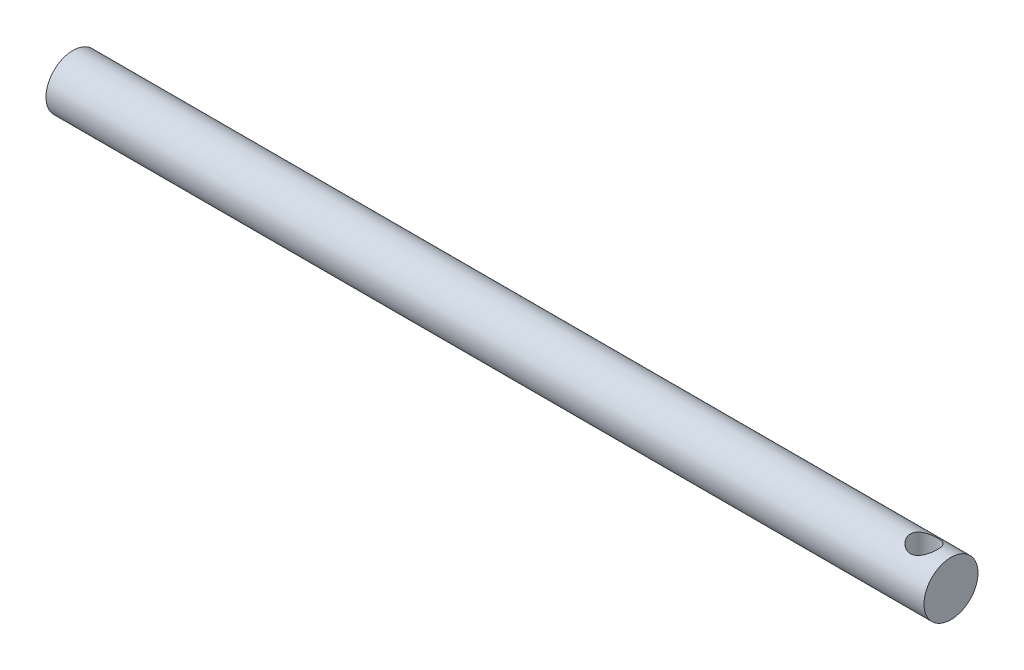
ISO-10303-21;
HEADER;
FILE_DESCRIPTION(('STEP AP214'),'2;1');
FILE_NAME('part.step','',(''),(''),'','','');
FILE_SCHEMA(('AUTOMOTIVE_DESIGN { 1 0 10303 214 1 1 1 1 }'));
ENDSEC;
DATA;
#1=APPLICATION_CONTEXT('core data for automotive mechanical design processes');
#2=APPLICATION_PROTOCOL_DEFINITION('international standard','automotive_design',2000,#1);
#3=PRODUCT_CONTEXT('',#1,'mechanical');
#4=PRODUCT('Part','Part','',(#3));
#5=PRODUCT_RELATED_PRODUCT_CATEGORY('part','',(#4));
#6=PRODUCT_DEFINITION_FORMATION('','',#4);
#7=PRODUCT_DEFINITION_CONTEXT('part definition',#1,'design');
#8=PRODUCT_DEFINITION('design','',#6,#7);
#9=PRODUCT_DEFINITION_SHAPE('','',#8);
#10=(LENGTH_UNIT() NAMED_UNIT(*) SI_UNIT(.MILLI.,.METRE.));
#11=(NAMED_UNIT(*) PLANE_ANGLE_UNIT() SI_UNIT($,.RADIAN.));
#12=(NAMED_UNIT(*) SI_UNIT($,.STERADIAN.) SOLID_ANGLE_UNIT());
#13=UNCERTAINTY_MEASURE_WITH_UNIT(LENGTH_MEASURE(1.E-05),#10,'distance_accuracy_value','');
#14=(GEOMETRIC_REPRESENTATION_CONTEXT(3) GLOBAL_UNCERTAINTY_ASSIGNED_CONTEXT((#13)) GLOBAL_UNIT_ASSIGNED_CONTEXT((#10,
#11,#12)) REPRESENTATION_CONTEXT('',''));
#15=CARTESIAN_POINT('',(0.,0.,0.));
#16=DIRECTION('',(0.,0.,1.));
#17=DIRECTION('',(1.,0.,0.));
#18=AXIS2_PLACEMENT_3D('',#15,#16,#17);
#19=CARTESIAN_POINT('',(325.,0.,0.));
#20=DIRECTION('',(-1.,0.,0.));
#21=DIRECTION('',(0.,0.,1.));
#22=AXIS2_PLACEMENT_3D('',#19,#20,#21);
#23=CYLINDRICAL_SURFACE('',#22,10.);
#24=CARTESIAN_POINT('',(310.,-10.,0.));
#25=CARTESIAN_POINT('',(310.000000432216,-9.99999960171885,0.131488890078728));
#26=CARTESIAN_POINT('',(310.005192775285,-9.99740053121284,0.262986970217151));
#27=CARTESIAN_POINT('',(310.025902894112,-9.98706977835168,0.525014586348055));
#28=CARTESIAN_POINT('',(310.041425161764,-9.97933586314931,0.655543676003293));
#29=CARTESIAN_POINT('',(310.082640779477,-9.95892066969002,0.914783203431131));
#30=CARTESIAN_POINT('',(310.108348634406,-9.94623233642882,1.04349077535257));
#31=CARTESIAN_POINT('',(310.169650672563,-9.91622716576671,1.29802636754293));
#32=CARTESIAN_POINT('',(310.205248897406,-9.89890843630383,1.42385318781692));
#33=CARTESIAN_POINT('',(310.285778482451,-9.86015430154804,1.67121386584967));
#34=CARTESIAN_POINT('',(310.330668648548,-9.83873709670758,1.79276399094562));
#35=CARTESIAN_POINT('',(310.429448797807,-9.79224427489324,2.0314444775119));
#36=CARTESIAN_POINT('',(310.483342168193,-9.7671672814684,2.14857315511666));
#37=CARTESIAN_POINT('',(310.657799628939,-9.68730860488736,2.49222561412915));
#38=CARTESIAN_POINT('',(310.79123077324,-9.6278546021617,2.71128846115304));
#39=CARTESIAN_POINT('',(311.097605281245,-9.49780663424162,3.13758045755123));
#40=CARTESIAN_POINT('',(311.27245069028,-9.42675632671348,3.34329192972866));
#41=CARTESIAN_POINT('',(311.652589088283,-9.28300214475254,3.72388133818107));
#42=CARTESIAN_POINT('',(311.857905061984,-9.21029705743543,3.89873577832561));
#43=CARTESIAN_POINT('',(312.312475147464,-9.06493867332993,4.22628385620053));
#44=CARTESIAN_POINT('',(312.563901891317,-8.99272664170302,4.37620734766692));
#45=CARTESIAN_POINT('',(312.959918044368,-8.89637417546677,4.56723365243867));
#46=CARTESIAN_POINT('',(313.09511829056,-8.86624279684719,4.62527981130996));
#47=CARTESIAN_POINT('',(313.371001251774,-8.81109611627222,4.72948843578256));
#48=CARTESIAN_POINT('',(313.511680663639,-8.78607778701963,4.77565793744268));
#49=CARTESIAN_POINT('',(313.788992754156,-8.74350562362059,4.85313805846159));
#50=CARTESIAN_POINT('',(313.925370479978,-8.72559704108876,4.88516762296957));
#51=CARTESIAN_POINT('',(314.20092569748,-8.69596333711106,4.93772573892404));
#52=CARTESIAN_POINT('',(314.340101663006,-8.68423493515241,4.95826039236647));
#53=CARTESIAN_POINT('',(314.620007461111,-8.66746161087015,4.98752398958935));
#54=CARTESIAN_POINT('',(314.760736306314,-8.66241266349288,4.99626004329764));
#55=CARTESIAN_POINT('',(315.04250117629,-8.65921299638945,5.00180399494054));
#56=CARTESIAN_POINT('',(315.183537170471,-8.6610616185123,4.99861303092503));
#57=CARTESIAN_POINT('',(315.447703572877,-8.67093727173594,4.98145803092845));
#58=CARTESIAN_POINT('',(315.57095260281,-8.67819663501131,4.9688320837109));
#59=CARTESIAN_POINT('',(315.815821213967,-8.69773906996624,4.93454402662213));
#60=CARTESIAN_POINT('',(315.937440271022,-8.71002371946269,4.91287907868332));
#61=CARTESIAN_POINT('',(316.178197874313,-8.7392147957695,4.86076278292652));
#62=CARTESIAN_POINT('',(316.29733672485,-8.75612065195561,4.83031251988903));
#63=CARTESIAN_POINT('',(316.532471376954,-8.79403073984606,4.76094319159973));
#64=CARTESIAN_POINT('',(316.648465923276,-8.81503658165343,4.72202079856856));
#65=CARTESIAN_POINT('',(316.996006871619,-8.88436032421637,4.59108661358501));
#66=CARTESIAN_POINT('',(317.221693356038,-8.93828791833521,4.48608785825885));
#67=CARTESIAN_POINT('',(317.653210118223,-9.05517433078603,4.24519591002762));
#68=CARTESIAN_POINT('',(317.859031417759,-9.11813720101033,4.10928884013352));
#69=CARTESIAN_POINT('',(318.272588528204,-9.25565455759081,3.79034422310326));
#70=CARTESIAN_POINT('',(318.477258007707,-9.33066654203131,3.60351571642875));
#71=CARTESIAN_POINT('',(318.853703465689,-9.47739013910051,3.19773444843251));
#72=CARTESIAN_POINT('',(319.025463723821,-9.54910016205802,2.97876642220595));
#73=CARTESIAN_POINT('',(319.258440897113,-9.65034506582222,2.62430600098779));
#74=CARTESIAN_POINT('',(319.333352095146,-9.68370380274256,2.49871002336157));
#75=CARTESIAN_POINT('',(319.472208202972,-9.74663052718474,2.24071060142557));
#76=CARTESIAN_POINT('',(319.536157735591,-9.77620011135784,2.10831005755406));
#77=CARTESIAN_POINT('',(319.652398875383,-9.83067553510546,1.83762803314801));
#78=CARTESIAN_POINT('',(319.704695175525,-9.85558325144947,1.69934894682176));
#79=CARTESIAN_POINT('',(319.79702492908,-9.89999026457504,1.41791187896082));
#80=CARTESIAN_POINT('',(319.837059793182,-9.91949018350379,1.27475446078986));
#81=CARTESIAN_POINT('',(319.901533563503,-9.95109597328192,0.996798015430399));
#82=CARTESIAN_POINT('',(319.926989515402,-9.96368046334326,0.862288674029779));
#83=CARTESIAN_POINT('',(319.966808041224,-9.98343035732268,0.59124836001245));
#84=CARTESIAN_POINT('',(319.98117159579,-9.99059624028198,0.454717567193943));
#85=CARTESIAN_POINT('',(319.998613162034,-9.99930380487356,0.180810709359644));
#86=CARTESIAN_POINT('',(320.001695494267,-10.000847639673,0.043434988135895));
#87=CARTESIAN_POINT('',(319.996544426081,-9.99827237859039,-0.231047608581555));
#88=CARTESIAN_POINT('',(319.988311526451,-9.99415353332644,-0.368154495704342));
#89=CARTESIAN_POINT('',(319.961721326159,-9.98090973082445,-0.630324023952248));
#90=CARTESIAN_POINT('',(319.944201622407,-9.97219922243105,-0.755493751243224));
#91=CARTESIAN_POINT('',(319.899825526429,-9.95027227352716,-1.00380426086805));
#92=CARTESIAN_POINT('',(319.872966176907,-9.93705440583578,-1.12694438760008));
#93=CARTESIAN_POINT('',(319.810197316637,-9.90642450404114,-1.37032307172127));
#94=CARTESIAN_POINT('',(319.774290575322,-9.88901375346267,-1.49056250470178));
#95=CARTESIAN_POINT('',(319.693771838677,-9.85039368148873,-1.7274794686754));
#96=CARTESIAN_POINT('',(319.649156508647,-9.82918290524069,-1.84415561535683));
#97=CARTESIAN_POINT('',(319.50005219315,-9.75922876416582,-2.19430354472274));
#98=CARTESIAN_POINT('',(319.382059258215,-9.70504904478179,-2.42111320848943));
#99=CARTESIAN_POINT('',(319.11444780678,-9.58719375745592,-2.85234560158079));
#100=CARTESIAN_POINT('',(318.964815818008,-9.5235141477638,-3.05675873773467));
#101=CARTESIAN_POINT('',(318.621212708963,-9.38541505392104,-3.45882132675024));
#102=CARTESIAN_POINT('',(318.424330408248,-9.31055499361996,-3.65383533419943));
#103=CARTESIAN_POINT('',(318.000329462866,-9.16310881759144,-4.00930667677965));
#104=CARTESIAN_POINT('',(317.773190076002,-9.09052430437332,-4.16974010650664));
#105=CARTESIAN_POINT('',(317.407509433771,-8.98785260582618,-4.3846601691921));
#106=CARTESIAN_POINT('',(317.278149125457,-8.95395955241384,-4.45326762267119));
#107=CARTESIAN_POINT('',(317.013105899221,-8.89022352415079,-4.57918112262682));
#108=CARTESIAN_POINT('',(316.877425879624,-8.8603787168037,-4.63649228788886));
#109=CARTESIAN_POINT('',(316.600722964675,-8.80590327365628,-4.73913999074898));
#110=CARTESIAN_POINT('',(316.45970454425,-8.78126837994729,-4.78448631442401));
#111=CARTESIAN_POINT('',(316.173308957175,-8.73822819098158,-4.86265004333096));
#112=CARTESIAN_POINT('',(316.027932469172,-8.71982193121851,-4.8954693884711));
#113=CARTESIAN_POINT('',(315.748235018465,-8.69151275671387,-4.94553834792941));
#114=CARTESIAN_POINT('',(315.61419211688,-8.68096327035261,-4.96397997433444));
#115=CARTESIAN_POINT('',(315.344714754303,-8.66606824539578,-4.98993873206132));
#116=CARTESIAN_POINT('',(315.209280440605,-8.66172205679784,-4.99745700797002));
#117=CARTESIAN_POINT('',(314.938243074995,-8.65941425656731,-5.00145477351747));
#118=CARTESIAN_POINT('',(314.80264009915,-8.66145040076354,-4.99793814327598));
#119=CARTESIAN_POINT('',(314.532414442052,-8.67181681785817,-4.97992974203945));
#120=CARTESIAN_POINT('',(314.397791720895,-8.68014683308829,-4.96543842034335));
#121=CARTESIAN_POINT('',(314.143439797841,-8.70167828744801,-4.92759757627215));
#122=CARTESIAN_POINT('',(314.023517440376,-8.71433770908853,-4.90522766015));
#123=CARTESIAN_POINT('',(313.786138809433,-8.74411599480516,-4.85194376743194));
#124=CARTESIAN_POINT('',(313.668683310666,-8.76123623781642,-4.82102714868722));
#125=CARTESIAN_POINT('',(313.321082884887,-8.81854231868725,-4.71590306073959));
#126=CARTESIAN_POINT('',(313.095543905014,-8.86468813771129,-4.62929708984156));
#127=CARTESIAN_POINT('',(312.646839657688,-8.97142890954605,-4.41907164675022));
#128=CARTESIAN_POINT('',(312.424851924011,-9.03278633647388,-4.29335633682033));
#129=CARTESIAN_POINT('',(312.003635890404,-9.16176636495219,-4.01075421010745));
#130=CARTESIAN_POINT('',(311.804419516556,-9.22939221620456,-3.85385117607731));
#131=CARTESIAN_POINT('',(311.409292141529,-9.3731144460079,-3.49102748964404));
#132=CARTESIAN_POINT('',(311.216723981232,-9.44924162905912,-3.28146736342597));
#133=CARTESIAN_POINT('',(310.868665578817,-9.59389514971536,-2.83072875767412));
#134=CARTESIAN_POINT('',(310.713195322256,-9.66241737976038,-2.58953334336122));
#135=CARTESIAN_POINT('',(310.511369585473,-9.75419013375831,-2.20753881885371));
#136=CARTESIAN_POINT('',(310.449132920594,-9.78304209980294,-2.07625512570268));
#137=CARTESIAN_POINT('',(310.33606384388,-9.83614745234556,-1.80799529933997));
#138=CARTESIAN_POINT('',(310.285225829469,-9.8604030970797,-1.6710220020515));
#139=CARTESIAN_POINT('',(310.195654561633,-9.90354484128718,-1.39269501068687));
#140=CARTESIAN_POINT('',(310.156894907012,-9.92244264379385,-1.25135162347081));
#141=CARTESIAN_POINT('',(310.091862403731,-9.95434618112011,-0.965237205795553));
#142=CARTESIAN_POINT('',(310.065581927473,-9.96735551489675,-0.820468326048366));
#143=CARTESIAN_POINT('',(310.030525468001,-9.98476387878718,-0.563041654408151));
#144=CARTESIAN_POINT('',(310.019088246308,-9.99046741601666,-0.450825809730017));
#145=CARTESIAN_POINT('',(310.00382522175,-9.99808569986015,-0.22574224605026));
#146=CARTESIAN_POINT('',(309.999999628971,-10.000000341898,-0.112874509142186));
#147=CARTESIAN_POINT('',(310.,-10.,0.));
#148=B_SPLINE_CURVE_WITH_KNOTS('',3,(#24,#25,#26,#27,#28,#29,#30,#31,#32,#33,#34,#35,#36,#37,
#38,#39,#40,#41,#42,#43,#44,#45,#46,#47,#48,#49,#50,#51,#52,#53,#54,#55,#56,#57,#58,#59,#60,#61,
#62,#63,#64,#65,#66,#67,#68,#69,#70,#71,#72,#73,#74,#75,#76,#77,#78,#79,#80,#81,#82,#83,#84,#85,
#86,#87,#88,#89,#90,#91,#92,#93,#94,#95,#96,#97,#98,#99,#100,#101,#102,#103,#104,#105,#106,#107,
#108,#109,#110,#111,#112,#113,#114,#115,#116,#117,#118,#119,#120,#121,#122,#123,#124,#125,#126,
#127,#128,#129,#130,#131,#132,#133,#134,#135,#136,#137,#138,#139,#140,#141,#142,#143,#144,#145,
#146,#147),.UNSPECIFIED.,.T.,.F.,(4,2,2,2,2,2,2,2,2,2,2,2,2,2,2,2,2,2,2,2,2,2,2,2,2,2,2,2,2,2,2,
2,2,2,2,2,2,2,2,2,2,2,2,2,2,2,2,2,2,2,2,2,2,2,2,2,2,2,2,2,2,4),(0.,0.394355294649889,
0.788882184037817,1.18397293369034,1.57922537181693,1.97276168530544,2.36644639154631,
3.15295441699267,3.98704440767526,4.82176680235499,5.72122193562247,6.17125359989456,
6.62101803579303,7.04410338623952,7.46696393118359,7.88956954321094,8.3121348321667,
8.68401534897466,9.05601271689176,9.42796417149682,9.80006198990957,10.56083380205,
11.3219478566367,12.1795688603196,13.03759852356,13.4870830845772,13.9363776171859,
14.3854908824168,14.8345524573652,15.2464230691106,15.6582572644723,16.0699337163998,
16.4815919489941,16.861220064051,17.240968493866,17.6206008225791,18.0003788066131,
18.7808755264614,19.5617052624834,20.4192132572738,21.2773121558254,21.7277011924365,
22.1778856687595,22.6277007885002,23.0774462222893,23.4840267197958,23.8905646113035,
24.2969595710183,24.7033378940059,25.0708552370354,25.4384863225851,26.1732662495598,
26.9574126491566,27.7419678673238,28.6218519479817,29.5022089791541,29.9460734671027,
30.3897193096443,30.8323885049026,31.2747867798492,31.6133053554876,31.9518332743451),.UNSPECIFIED.);
#149=CARTESIAN_POINT('',(310.,-10.,0.));
#150=VERTEX_POINT('',#149);
#151=EDGE_CURVE('E10',#150,#150,#148,.T.);
#152=ORIENTED_EDGE('',*,*,#151,.T.);
#153=EDGE_LOOP('',(#152));
#154=FACE_BOUND('',#153,.T.);
#155=CARTESIAN_POINT('',(315.,8.66025403784439,4.99999999999999));
#156=CARTESIAN_POINT('',(314.869668343204,8.66025482828519,4.99999937774202));
#157=CARTESIAN_POINT('',(314.739325091653,8.66320639320551,4.99489703999514));
#158=CARTESIAN_POINT('',(314.479644781747,8.67490215579888,4.97455590140418));
#159=CARTESIAN_POINT('',(314.3503082202,8.68364905023327,4.9593123815141));
#160=CARTESIAN_POINT('',(314.093486462436,8.70662912382781,4.91885673177676));
#161=CARTESIAN_POINT('',(313.966004496215,8.72087090589727,4.89362896878987));
#162=CARTESIAN_POINT('',(313.713982535512,8.75432466229382,4.83352579766962));
#163=CARTESIAN_POINT('',(313.589443845965,8.77353879767271,4.79864619425835));
#164=CARTESIAN_POINT('',(313.222888792466,8.83745677232209,4.68053466147078));
#165=CARTESIAN_POINT('',(312.986267679266,8.8885988097752,4.58356144574884));
#166=CARTESIAN_POINT('',(312.532838045211,9.00213659941723,4.35632594214355));
#167=CARTESIAN_POINT('',(312.316030597053,9.06453296036385,4.22606185336435));
#168=CARTESIAN_POINT('',(311.888489382253,9.19984032823,3.92334549410418));
#169=CARTESIAN_POINT('',(311.679731417677,9.27319410334728,3.74829976483492));
#170=CARTESIAN_POINT('',(311.292930948451,9.41860822234892,3.36622943427773));
#171=CARTESIAN_POINT('',(311.114903765034,9.49066790509843,3.15918897852743));
#172=CARTESIAN_POINT('',(310.868773571314,9.59484443095073,2.82033206345805));
#173=CARTESIAN_POINT('',(310.788086847899,9.62993554487431,2.69838192133583));
#174=CARTESIAN_POINT('',(310.637371334578,9.69680156689126,2.4472213123705));
#175=CARTESIAN_POINT('',(310.567338302637,9.72857779329812,2.31801376345372));
#176=CARTESIAN_POINT('',(310.438623768707,9.78789520431625,2.05317391777881));
#177=CARTESIAN_POINT('',(310.37993934252,9.81543747951443,1.91754328730046));
#178=CARTESIAN_POINT('',(310.274568984172,9.86547242365067,1.64079696990286));
#179=CARTESIAN_POINT('',(310.227881777567,9.88796562891049,1.49968186742445));
#180=CARTESIAN_POINT('',(310.149984487482,9.92580359946711,1.2233043659956));
#181=CARTESIAN_POINT('',(310.117909890397,9.94154295735176,1.08833937324156));
#182=CARTESIAN_POINT('',(310.065033571396,9.96761571585522,0.815709188800214));
#183=CARTESIAN_POINT('',(310.04423075194,9.97794964280152,0.678044261360656));
#184=CARTESIAN_POINT('',(310.014180088583,9.99290900237256,0.401217055741356));
#185=CARTESIAN_POINT('',(310.004926667024,9.99753719051025,0.262055533104011));
#186=CARTESIAN_POINT('',(309.998085666602,10.0009568128334,-0.0166220416280668));
#187=CARTESIAN_POINT('',(310.000497374007,9.99974860411976,-0.156138071510179));
#188=CARTESIAN_POINT('',(310.016230602951,9.99189263105534,-0.42215828714551));
#189=CARTESIAN_POINT('',(310.028581770782,9.9857287219252,-0.548735568605429));
#190=CARTESIAN_POINT('',(310.062832572355,9.9687211507105,-0.800312348574858));
#191=CARTESIAN_POINT('',(310.084735221026,9.95787601100424,-0.925311336065673));
#192=CARTESIAN_POINT('',(310.137846224237,9.93176736436012,-1.17280363036127));
#193=CARTESIAN_POINT('',(310.169051465862,9.91650533549045,-1.29529776073401));
#194=CARTESIAN_POINT('',(310.240447651518,9.88192155120269,-1.53706747687732));
#195=CARTESIAN_POINT('',(310.280642037248,9.86259824100145,-1.65634181022019));
#196=CARTESIAN_POINT('',(310.415374539564,9.79859222392452,-2.01140340124726));
#197=CARTESIAN_POINT('',(310.523368958893,9.74822622058319,-2.24122720645221));
#198=CARTESIAN_POINT('',(310.771329692493,9.63687815372568,-2.67992393299633));
#199=CARTESIAN_POINT('',(310.911307453156,9.57589229137332,-2.88878931500036));
#200=CARTESIAN_POINT('',(311.234463473773,9.44222356886893,-3.30085071454947));
#201=CARTESIAN_POINT('',(311.420474603121,9.36897995679248,-3.5016445201989));
#202=CARTESIAN_POINT('',(311.822989193921,9.22270586177089,-3.87054772569915));
#203=CARTESIAN_POINT('',(312.039515896908,9.14967558498934,-4.03863197852245));
#204=CARTESIAN_POINT('',(312.391193537281,9.04390911775426,-4.26795395788388));
#205=CARTESIAN_POINT('',(312.51705093115,9.00829977481544,-4.34240098162069));
#206=CARTESIAN_POINT('',(312.77551387827,8.94051483957136,-4.48030007564992));
#207=CARTESIAN_POINT('',(312.908116558879,8.90833780332001,-4.54375677655285));
#208=CARTESIAN_POINT('',(313.179203490355,8.84860631442919,-4.65901104656174));
#209=CARTESIAN_POINT('',(313.317684118981,8.82104906525584,-4.71081567564996));
#210=CARTESIAN_POINT('',(313.599621346051,8.77164844236192,-4.80217514780261));
#211=CARTESIAN_POINT('',(313.743077263025,8.74980428958557,-4.841731661194));
#212=CARTESIAN_POINT('',(314.022256935075,8.71426171459814,-4.90539138118895));
#213=CARTESIAN_POINT('',(314.157693733557,8.70005532848252,-4.93047005719822));
#214=CARTESIAN_POINT('',(314.430671907805,8.67788216659554,-4.9693929943291));
#215=CARTESIAN_POINT('',(314.568213023391,8.66991462570622,-4.9832386330527));
#216=CARTESIAN_POINT('',(314.844115492459,8.66056020235634,-4.99947854378904));
#217=CARTESIAN_POINT('',(314.98247633223,8.65916956150025,-5.00187935599939));
#218=CARTESIAN_POINT('',(315.258820904932,8.66301922537735,-4.99520900229024));
#219=CARTESIAN_POINT('',(315.396804662689,8.6682590825254,-4.98613861072293));
#220=CARTESIAN_POINT('',(315.656088079399,8.68421505193303,-4.95828928039378));
#221=CARTESIAN_POINT('',(315.777556714335,8.69426699139329,-4.94068517767343));
#222=CARTESIAN_POINT('',(316.018417575916,8.71910498639123,-4.8967167334579));
#223=CARTESIAN_POINT('',(316.137809151073,8.73389250003321,-4.87034969372092));
#224=CARTESIAN_POINT('',(316.491710041443,8.78469607426189,-4.77850297980869));
#225=CARTESIAN_POINT('',(316.722114291832,8.82716454630259,-4.7002591459757));
#226=CARTESIAN_POINT('',(317.177093235683,8.92681241600885,-4.50823244687956));
#227=CARTESIAN_POINT('',(317.400903691952,8.98458205429472,-4.39297142446301));
#228=CARTESIAN_POINT('',(317.82733774558,9.10780608277643,-4.1314342135104));
#229=CARTESIAN_POINT('',(318.029950379078,9.1732644129012,-3.9851420924436));
#230=CARTESIAN_POINT('',(318.434891403638,9.3143979576891,-3.64419701683801));
#231=CARTESIAN_POINT('',(318.63396448388,9.3903209386106,-3.44577250062106));
#232=CARTESIAN_POINT('',(318.997082466847,9.53671997076951,-3.01697632238967));
#233=CARTESIAN_POINT('',(319.161115537395,9.60719417697592,-2.78659391213233));
#234=CARTESIAN_POINT('',(319.379009473771,9.70419418614479,-2.41774074756938));
#235=CARTESIAN_POINT('',(319.44766209982,9.73542921288423,-2.28903769990886));
#236=CARTESIAN_POINT('',(319.573756518654,9.79367711332059,-2.02535752273873));
#237=CARTESIAN_POINT('',(319.631203276876,9.82069185600805,-1.89038320507349));
#238=CARTESIAN_POINT('',(319.734217908457,9.86968940022035,-1.61516754079526));
#239=CARTESIAN_POINT('',(319.779791447889,9.89167460130352,-1.47492874316052));
#240=CARTESIAN_POINT('',(319.858509076018,9.92995088678441,-1.19024723850078));
#241=CARTESIAN_POINT('',(319.891654638615,9.94624264638291,-1.04580503217189));
#242=CARTESIAN_POINT('',(319.942595033624,9.97139931839171,-0.76740144168214));
#243=CARTESIAN_POINT('',(319.961519602643,9.98080865626407,-0.633694933854994));
#244=CARTESIAN_POINT('',(319.988493453182,9.99424478074505,-0.364924207537142));
#245=CARTESIAN_POINT('',(319.996543574957,9.9982719832244,-0.229860094759451));
#246=CARTESIAN_POINT('',(320.001663177181,10.0008314531461,0.0404881253987078));
#247=CARTESIAN_POINT('',(319.998735853363,9.999365319798,0.17577215729487));
#248=CARTESIAN_POINT('',(319.981947452247,9.99098333266103,0.4454852394891));
#249=CARTESIAN_POINT('',(319.968086675948,9.98406762889855,0.579914313221414));
#250=CARTESIAN_POINT('',(319.930882320583,9.96560870935097,0.838004211928003));
#251=CARTESIAN_POINT('',(319.908227165773,9.95440210269675,0.961788818118142));
#252=CARTESIAN_POINT('',(319.853786844462,9.92767317989822,1.2068703249142));
#253=CARTESIAN_POINT('',(319.821998770643,9.91214948953036,1.32816642014823));
#254=CARTESIAN_POINT('',(319.713391755729,9.859612953764,1.68709586409474));
#255=CARTESIAN_POINT('',(319.623298074914,9.8166181760533,1.91998814282435));
#256=CARTESIAN_POINT('',(319.40635777828,9.71629432734439,2.37715486497024));
#257=CARTESIAN_POINT('',(319.278104034551,9.65843082383811,2.60063468941493));
#258=CARTESIAN_POINT('',(318.990209694815,9.53440669320975,3.02386422902505));
#259=CARTESIAN_POINT('',(318.830554682968,9.46824226032903,3.22360297720277));
#260=CARTESIAN_POINT('',(318.466024828893,9.32643278468728,3.61456788757421));
#261=CARTESIAN_POINT('',(318.258230966454,9.25049954016333,3.8029686088828));
#262=CARTESIAN_POINT('',(317.812702952286,9.10314421011871,4.1433362682368));
#263=CARTESIAN_POINT('',(317.574942593432,9.03172615645364,4.29527097306546));
#264=CARTESIAN_POINT('',(317.195780333282,8.93341291054548,4.49442606762733));
#265=CARTESIAN_POINT('',(317.063373671791,8.90168698468314,4.55675683233956));
#266=CARTESIAN_POINT('',(316.792744536233,8.8428797220414,4.66985426801938));
#267=CARTESIAN_POINT('',(316.654525101206,8.81579599491155,4.72062689492348));
#268=CARTESIAN_POINT('',(316.373592125707,8.76742025858706,4.80987708806143));
#269=CARTESIAN_POINT('',(316.230891206915,8.74611337114853,4.84838628432609));
#270=CARTESIAN_POINT('',(315.941907855529,8.71014784774039,4.91270711070743));
#271=CARTESIAN_POINT('',(315.795628002391,8.69548456411173,4.93852761851021));
#272=CARTESIAN_POINT('',(315.541002113071,8.67647541111359,4.97182308032502));
#273=CARTESIAN_POINT('',(315.433175783773,8.67040719452514,4.98237929832922));
#274=CARTESIAN_POINT('',(315.216902340018,8.66229604436745,4.99646825199978));
#275=CARTESIAN_POINT('',(315.108455184517,8.66025338008092,5.00000051781051));
#276=CARTESIAN_POINT('',(315.,8.66025403784439,4.99999999999999));
#277=B_SPLINE_CURVE_WITH_KNOTS('',3,(#155,#156,#157,#158,#159,#160,#161,#162,#163,#164,#165,
#166,#167,#168,#169,#170,#171,#172,#173,#174,#175,#176,#177,#178,#179,#180,#181,#182,#183,#184,
#185,#186,#187,#188,#189,#190,#191,#192,#193,#194,#195,#196,#197,#198,#199,#200,#201,#202,#203,
#204,#205,#206,#207,#208,#209,#210,#211,#212,#213,#214,#215,#216,#217,#218,#219,#220,#221,#222,
#223,#224,#225,#226,#227,#228,#229,#230,#231,#232,#233,#234,#235,#236,#237,#238,#239,#240,#241,
#242,#243,#244,#245,#246,#247,#248,#249,#250,#251,#252,#253,#254,#255,#256,#257,#258,#259,#260,
#261,#262,#263,#264,#265,#266,#267,#268,#269,#270,#271,#272,#273,#274,#275,#276),.UNSPECIFIED.,
.T.,.F.,(4,2,2,2,2,2,2,2,2,2,2,2,2,2,2,2,2,2,2,2,2,2,2,2,2,2,2,2,2,2,2,2,2,2,2,2,2,2,2,2,2,2,2,
2,2,2,2,2,2,2,2,2,2,2,2,2,2,2,2,2,4),(0.,0.390882384556492,0.781946787673715,1.17362595011565,
1.56547562833135,2.34415414386118,3.12287479153469,3.96582272680014,4.80918971852757,
5.25982992442629,5.71029022430252,6.16063429887937,6.61093051439734,7.02920538093651,
7.44743951241414,7.86547158389038,8.28347807833435,8.66500933177611,9.04666110301428,
9.42818530565605,9.8098558343883,10.5829669450729,11.3563551760291,12.202849781349,
13.0499926207968,13.5010020973219,13.9518210829088,14.4023661773262,14.8528498019287,
15.2676702585957,15.6824398346427,16.0969723603125,16.5114769048701,16.8804871114428,
17.2496110473148,17.9873544979167,18.7592666964179,19.5315761871159,20.4012390551442,
21.2711951250236,21.7182117808488,22.1650299066983,22.6116344121698,23.0581859356052,
23.4637505264203,23.8692837779652,24.2746989806127,24.6801030225935,25.0586722294313,
25.4373620814587,26.1940875134848,26.9831783738577,27.77263234292,28.6406529303874,
29.5094379801418,29.9581473751206,30.4066250230036,30.8539364017615,31.3009343703531,
31.6261844795329,31.9514563450475),.UNSPECIFIED.);
#278=CARTESIAN_POINT('',(315.,8.66025403784439,4.99999999999999));
#279=VERTEX_POINT('',#278);
#280=EDGE_CURVE('E49',#279,#279,#277,.T.);
#281=ORIENTED_EDGE('',*,*,#280,.T.);
#282=EDGE_LOOP('',(#281));
#283=FACE_BOUND('',#282,.T.);
#284=CARTESIAN_POINT('',(325.,0.,0.));
#285=DIRECTION('',(1.,0.,0.));
#286=DIRECTION('',(0.,0.,-1.));
#287=AXIS2_PLACEMENT_3D('',#284,#285,#286);
#288=CIRCLE('',#287,10.);
#289=CARTESIAN_POINT('',(325.,0.,-10.));
#290=VERTEX_POINT('',#289);
#291=EDGE_CURVE('E54',#290,#290,#288,.T.);
#292=ORIENTED_EDGE('',*,*,#291,.F.);
#293=EDGE_LOOP('',(#292));
#294=FACE_BOUND('',#293,.T.);
#295=CARTESIAN_POINT('',(0.,0.,0.));
#296=DIRECTION('',(1.,0.,0.));
#297=DIRECTION('',(0.,0.,-1.));
#298=AXIS2_PLACEMENT_3D('',#295,#296,#297);
#299=CIRCLE('',#298,10.);
#300=CARTESIAN_POINT('',(0.,0.,-10.));
#301=VERTEX_POINT('',#300);
#302=EDGE_CURVE('E59',#301,#301,#299,.T.);
#303=ORIENTED_EDGE('',*,*,#302,.T.);
#304=EDGE_LOOP('',(#303));
#305=FACE_BOUND('',#304,.T.);
#306=ADVANCED_FACE('F37',(#154,#283,#294,#305),#23,.T.);
#307=CARTESIAN_POINT('',(325.,0.,0.));
#308=DIRECTION('',(1.,0.,0.));
#309=DIRECTION('',(0.,0.,-1.));
#310=AXIS2_PLACEMENT_3D('',#307,#308,#309);
#311=PLANE('',#310);
#312=ORIENTED_EDGE('',*,*,#291,.T.);
#313=EDGE_LOOP('',(#312));
#314=FACE_BOUND('',#313,.T.);
#315=ADVANCED_FACE('F71',(#314),#311,.T.);
#316=CARTESIAN_POINT('',(0.,0.,0.));
#317=DIRECTION('',(1.,0.,0.));
#318=DIRECTION('',(0.,0.,-1.));
#319=AXIS2_PLACEMENT_3D('',#316,#317,#318);
#320=PLANE('',#319);
#321=ORIENTED_EDGE('',*,*,#302,.F.);
#322=EDGE_LOOP('',(#321));
#323=FACE_BOUND('',#322,.T.);
#324=ADVANCED_FACE('F69',(#323),#320,.F.);
#325=CARTESIAN_POINT('',(315.,-10.,0.));
#326=DIRECTION('',(0.,1.,0.));
#327=DIRECTION('',(0.,0.,1.));
#328=AXIS2_PLACEMENT_3D('',#325,#326,#327);
#329=CYLINDRICAL_SURFACE('',#328,4.99999999999999);
#330=ORIENTED_EDGE('',*,*,#280,.F.);
#331=EDGE_LOOP('',(#330));
#332=FACE_BOUND('',#331,.T.);
#333=ORIENTED_EDGE('',*,*,#151,.F.);
#334=EDGE_LOOP('',(#333));
#335=FACE_BOUND('',#334,.T.);
#336=ADVANCED_FACE('F65',(#332,#335),#329,.F.);
#337=CLOSED_SHELL('',(#306,#315,#324,#336));
#338=MANIFOLD_SOLID_BREP('B2',#337);
#339=ADVANCED_BREP_SHAPE_REPRESENTATION('',(#18,#338),#14);
#340=SHAPE_DEFINITION_REPRESENTATION(#9,#339);
ENDSEC;
END-ISO-10303-21;
